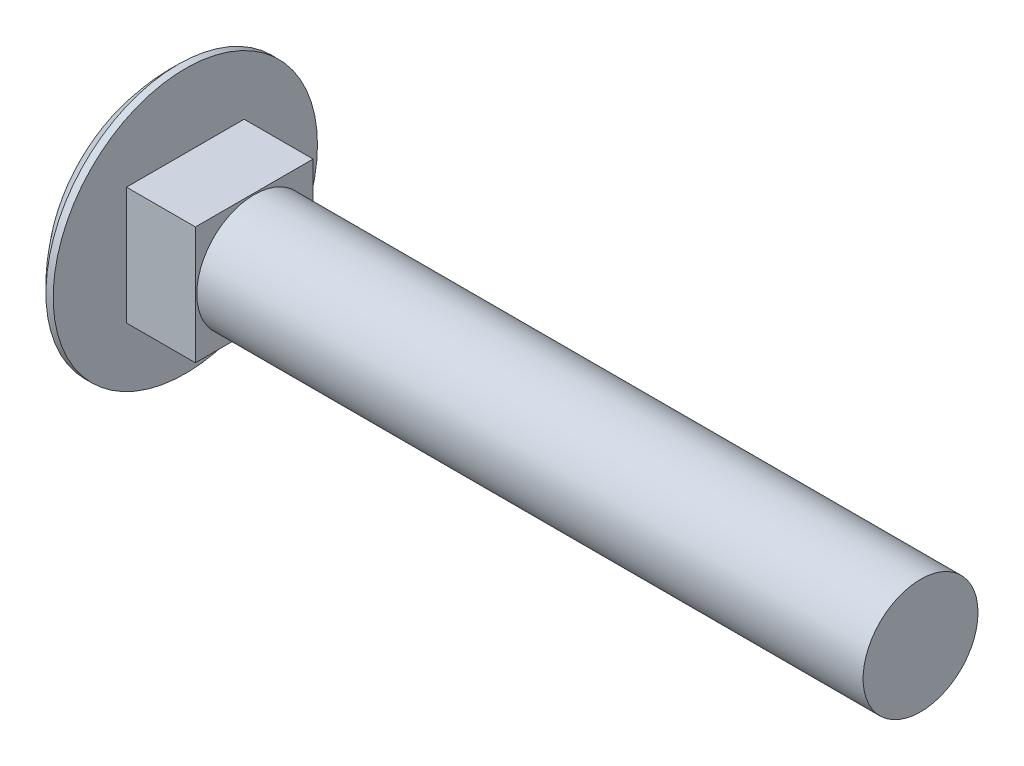
ISO-10303-21;
HEADER;
FILE_DESCRIPTION(('STEP AP214'),'2;1');
FILE_NAME('part.step','',(''),(''),'','','');
FILE_SCHEMA(('AUTOMOTIVE_DESIGN { 1 0 10303 214 1 1 1 1 }'));
ENDSEC;
DATA;
#1=APPLICATION_CONTEXT('core data for automotive mechanical design processes');
#2=APPLICATION_PROTOCOL_DEFINITION('international standard','automotive_design',2000,#1);
#3=PRODUCT_CONTEXT('',#1,'mechanical');
#4=PRODUCT('Part','Part','',(#3));
#5=PRODUCT_RELATED_PRODUCT_CATEGORY('part','',(#4));
#6=PRODUCT_DEFINITION_FORMATION('','',#4);
#7=PRODUCT_DEFINITION_CONTEXT('part definition',#1,'design');
#8=PRODUCT_DEFINITION('design','',#6,#7);
#9=PRODUCT_DEFINITION_SHAPE('','',#8);
#10=(LENGTH_UNIT() NAMED_UNIT(*) SI_UNIT(.MILLI.,.METRE.));
#11=(NAMED_UNIT(*) PLANE_ANGLE_UNIT() SI_UNIT($,.RADIAN.));
#12=(NAMED_UNIT(*) SI_UNIT($,.STERADIAN.) SOLID_ANGLE_UNIT());
#13=UNCERTAINTY_MEASURE_WITH_UNIT(LENGTH_MEASURE(1.E-05),#10,'distance_accuracy_value','');
#14=(GEOMETRIC_REPRESENTATION_CONTEXT(3) GLOBAL_UNCERTAINTY_ASSIGNED_CONTEXT((#13)) GLOBAL_UNIT_ASSIGNED_CONTEXT((#10,
#11,#12)) REPRESENTATION_CONTEXT('',''));
#15=CARTESIAN_POINT('',(0.,0.,0.));
#16=DIRECTION('',(0.,0.,1.));
#17=DIRECTION('',(1.,0.,0.));
#18=AXIS2_PLACEMENT_3D('',#15,#16,#17);
#19=CARTESIAN_POINT('',(4.4704,9.1313,0.));
#20=DIRECTION('',(1.,0.,0.));
#21=DIRECTION('',(0.,0.,-1.));
#22=AXIS2_PLACEMENT_3D('',#19,#20,#21);
#23=PLANE('',#22);
#24=CARTESIAN_POINT('',(4.4704,0.,0.));
#25=DIRECTION('',(1.,0.,0.));
#26=DIRECTION('',(0.,0.,-1.));
#27=AXIS2_PLACEMENT_3D('',#24,#25,#26);
#28=CIRCLE('',#27,9.1313);
#29=CARTESIAN_POINT('',(4.4704,0.,-9.1313));
#30=VERTEX_POINT('',#29);
#31=EDGE_CURVE('E42',#30,#30,#28,.T.);
#32=ORIENTED_EDGE('',*,*,#31,.T.);
#33=EDGE_LOOP('',(#32));
#34=FACE_BOUND('',#33,.T.);
#35=DIRECTION('',(0.,-1.,0.));
#36=VECTOR('',#35,1.);
#37=CARTESIAN_POINT('',(4.4704,-4.064,4.064));
#38=LINE('',#37,#36);
#39=CARTESIAN_POINT('',(4.4704,4.064,4.064));
#40=VERTEX_POINT('',#39);
#41=CARTESIAN_POINT('',(4.4704,-4.064,4.064));
#42=VERTEX_POINT('',#41);
#43=EDGE_CURVE('E88',#40,#42,#38,.T.);
#44=ORIENTED_EDGE('',*,*,#43,.F.);
#45=DIRECTION('',(0.,0.,1.));
#46=VECTOR('',#45,1.);
#47=CARTESIAN_POINT('',(4.4704,4.064,-4.064));
#48=LINE('',#47,#46);
#49=CARTESIAN_POINT('',(4.4704,4.064,-4.064));
#50=VERTEX_POINT('',#49);
#51=EDGE_CURVE('E49',#50,#40,#48,.T.);
#52=ORIENTED_EDGE('',*,*,#51,.F.);
#53=DIRECTION('',(0.,1.,0.));
#54=VECTOR('',#53,1.);
#55=CARTESIAN_POINT('',(4.4704,-4.064,-4.064));
#56=LINE('',#55,#54);
#57=CARTESIAN_POINT('',(4.4704,-4.064,-4.064));
#58=VERTEX_POINT('',#57);
#59=EDGE_CURVE('E94',#58,#50,#56,.T.);
#60=ORIENTED_EDGE('',*,*,#59,.F.);
#61=DIRECTION('',(0.,0.,-1.));
#62=VECTOR('',#61,1.);
#63=CARTESIAN_POINT('',(4.4704,-4.064,-4.064));
#64=LINE('',#63,#62);
#65=EDGE_CURVE('E80',#42,#58,#64,.T.);
#66=ORIENTED_EDGE('',*,*,#65,.F.);
#67=EDGE_LOOP('',(#44,#52,#60,#66));
#68=FACE_BOUND('',#67,.T.);
#69=ADVANCED_FACE('F34',(#34,#68),#23,.T.);
#70=CARTESIAN_POINT('',(12.4854820484082,0.,0.));
#71=DIRECTION('',(1.,0.,0.));
#72=DIRECTION('',(0.,1.,0.));
#73=AXIS2_PLACEMENT_3D('',#70,#71,#72);
#74=SPHERICAL_SURFACE('',#73,12.4854820484082);
#75=CARTESIAN_POINT('',(3.9704,0.,0.));
#76=DIRECTION('',(1.,0.,0.));
#77=DIRECTION('',(0.,0.,-1.));
#78=AXIS2_PLACEMENT_3D('',#75,#76,#77);
#79=CIRCLE('',#78,9.1313);
#80=CARTESIAN_POINT('',(3.9704,0.,-9.1313));
#81=VERTEX_POINT('',#80);
#82=EDGE_CURVE('E11',#81,#81,#79,.T.);
#83=ORIENTED_EDGE('',*,*,#82,.F.);
#84=EDGE_LOOP('',(#83));
#85=FACE_BOUND('',#84,.T.);
#86=ADVANCED_FACE('F36',(#85),#74,.T.);
#87=CARTESIAN_POINT('',(0.,0.,0.));
#88=DIRECTION('',(1.,0.,0.));
#89=DIRECTION('',(0.,0.,-1.));
#90=AXIS2_PLACEMENT_3D('',#87,#88,#89);
#91=CYLINDRICAL_SURFACE('',#90,9.1313);
#92=ORIENTED_EDGE('',*,*,#82,.T.);
#93=EDGE_LOOP('',(#92));
#94=FACE_BOUND('',#93,.T.);
#95=ORIENTED_EDGE('',*,*,#31,.F.);
#96=EDGE_LOOP('',(#95));
#97=FACE_BOUND('',#96,.T.);
#98=ADVANCED_FACE('F117',(#94,#97),#91,.T.);
#99=CARTESIAN_POINT('',(20.7276278349685,4.064,-4.064));
#100=DIRECTION('',(0.,-1.,0.));
#101=DIRECTION('',(0.,0.,-1.));
#102=AXIS2_PLACEMENT_3D('',#99,#100,#101);
#103=PLANE('',#102);
#104=DIRECTION('',(-1.,0.,0.));
#105=VECTOR('',#104,1.);
#106=CARTESIAN_POINT('',(20.7276278349685,4.064,4.064));
#107=LINE('',#106,#105);
#108=CARTESIAN_POINT('',(9.2329,4.064,4.064));
#109=VERTEX_POINT('',#108);
#110=EDGE_CURVE('E90',#109,#40,#107,.T.);
#111=ORIENTED_EDGE('',*,*,#110,.F.);
#112=DIRECTION('',(0.,0.,-1.));
#113=VECTOR('',#112,1.);
#114=CARTESIAN_POINT('',(9.2329,4.064,-4.064));
#115=LINE('',#114,#113);
#116=CARTESIAN_POINT('',(9.2329,4.064,-4.064));
#117=VERTEX_POINT('',#116);
#118=EDGE_CURVE('E84',#109,#117,#115,.T.);
#119=ORIENTED_EDGE('',*,*,#118,.T.);
#120=DIRECTION('',(-1.,0.,0.));
#121=VECTOR('',#120,1.);
#122=CARTESIAN_POINT('',(20.7276278349685,4.064,-4.064));
#123=LINE('',#122,#121);
#124=EDGE_CURVE('E101',#117,#50,#123,.T.);
#125=ORIENTED_EDGE('',*,*,#124,.T.);
#126=ORIENTED_EDGE('',*,*,#51,.T.);
#127=EDGE_LOOP('',(#111,#119,#125,#126));
#128=FACE_BOUND('',#127,.T.);
#129=ADVANCED_FACE('F119',(#128),#103,.F.);
#130=CARTESIAN_POINT('',(20.7276278349685,-4.064,-4.064));
#131=DIRECTION('',(0.,0.,1.));
#132=DIRECTION('',(1.,0.,0.));
#133=AXIS2_PLACEMENT_3D('',#130,#131,#132);
#134=PLANE('',#133);
#135=ORIENTED_EDGE('',*,*,#124,.F.);
#136=DIRECTION('',(0.,-1.,0.));
#137=VECTOR('',#136,1.);
#138=CARTESIAN_POINT('',(9.2329,-4.064,-4.064));
#139=LINE('',#138,#137);
#140=CARTESIAN_POINT('',(9.2329,-4.064,-4.064));
#141=VERTEX_POINT('',#140);
#142=EDGE_CURVE('E106',#117,#141,#139,.T.);
#143=ORIENTED_EDGE('',*,*,#142,.T.);
#144=DIRECTION('',(-1.,0.,0.));
#145=VECTOR('',#144,1.);
#146=CARTESIAN_POINT('',(20.7276278349685,-4.064,-4.064));
#147=LINE('',#146,#145);
#148=EDGE_CURVE('E85',#141,#58,#147,.T.);
#149=ORIENTED_EDGE('',*,*,#148,.T.);
#150=ORIENTED_EDGE('',*,*,#59,.T.);
#151=EDGE_LOOP('',(#135,#143,#149,#150));
#152=FACE_BOUND('',#151,.T.);
#153=ADVANCED_FACE('F125',(#152),#134,.F.);
#154=CARTESIAN_POINT('',(20.7276278349685,-4.064,-4.064));
#155=DIRECTION('',(0.,1.,0.));
#156=DIRECTION('',(0.,0.,1.));
#157=AXIS2_PLACEMENT_3D('',#154,#155,#156);
#158=PLANE('',#157);
#159=ORIENTED_EDGE('',*,*,#148,.F.);
#160=DIRECTION('',(0.,0.,1.));
#161=VECTOR('',#160,1.);
#162=CARTESIAN_POINT('',(9.2329,-4.064,-4.064));
#163=LINE('',#162,#161);
#164=CARTESIAN_POINT('',(9.2329,-4.064,4.064));
#165=VERTEX_POINT('',#164);
#166=EDGE_CURVE('E57',#141,#165,#163,.T.);
#167=ORIENTED_EDGE('',*,*,#166,.T.);
#168=DIRECTION('',(-1.,0.,0.));
#169=VECTOR('',#168,1.);
#170=CARTESIAN_POINT('',(20.7276278349685,-4.064,4.064));
#171=LINE('',#170,#169);
#172=EDGE_CURVE('E76',#165,#42,#171,.T.);
#173=ORIENTED_EDGE('',*,*,#172,.T.);
#174=ORIENTED_EDGE('',*,*,#65,.T.);
#175=EDGE_LOOP('',(#159,#167,#173,#174));
#176=FACE_BOUND('',#175,.T.);
#177=ADVANCED_FACE('F78',(#176),#158,.F.);
#178=CARTESIAN_POINT('',(20.7276278349685,-4.064,4.064));
#179=DIRECTION('',(0.,0.,-1.));
#180=DIRECTION('',(-1.,0.,0.));
#181=AXIS2_PLACEMENT_3D('',#178,#179,#180);
#182=PLANE('',#181);
#183=ORIENTED_EDGE('',*,*,#172,.F.);
#184=DIRECTION('',(0.,1.,0.));
#185=VECTOR('',#184,1.);
#186=CARTESIAN_POINT('',(9.2329,-4.064,4.064));
#187=LINE('',#186,#185);
#188=EDGE_CURVE('E111',#165,#109,#187,.T.);
#189=ORIENTED_EDGE('',*,*,#188,.T.);
#190=ORIENTED_EDGE('',*,*,#110,.T.);
#191=ORIENTED_EDGE('',*,*,#43,.T.);
#192=EDGE_LOOP('',(#183,#189,#190,#191));
#193=FACE_BOUND('',#192,.T.);
#194=ADVANCED_FACE('F89',(#193),#182,.F.);
#195=CARTESIAN_POINT('',(9.2329,3.81,0.));
#196=DIRECTION('',(-1.,0.,0.));
#197=DIRECTION('',(0.,0.,1.));
#198=AXIS2_PLACEMENT_3D('',#195,#196,#197);
#199=PLANE('',#198);
#200=CARTESIAN_POINT('',(9.2329,0.,0.));
#201=DIRECTION('',(-1.,0.,0.));
#202=DIRECTION('',(0.,0.,1.));
#203=AXIS2_PLACEMENT_3D('',#200,#201,#202);
#204=CIRCLE('',#203,3.96875);
#205=CARTESIAN_POINT('',(9.2329,0.,3.96875));
#206=VERTEX_POINT('',#205);
#207=EDGE_CURVE('E107',#206,#206,#204,.F.);
#208=ORIENTED_EDGE('',*,*,#207,.F.);
#209=EDGE_LOOP('',(#208));
#210=FACE_BOUND('',#209,.T.);
#211=ORIENTED_EDGE('',*,*,#166,.F.);
#212=ORIENTED_EDGE('',*,*,#142,.F.);
#213=ORIENTED_EDGE('',*,*,#118,.F.);
#214=ORIENTED_EDGE('',*,*,#188,.F.);
#215=EDGE_LOOP('',(#211,#212,#213,#214));
#216=FACE_BOUND('',#215,.T.);
#217=ADVANCED_FACE('F140',(#210,#216),#199,.F.);
#218=CARTESIAN_POINT('',(55.2704,3.96875,0.));
#219=DIRECTION('',(1.,0.,0.));
#220=DIRECTION('',(0.,0.,-1.));
#221=AXIS2_PLACEMENT_3D('',#218,#219,#220);
#222=PLANE('',#221);
#223=CARTESIAN_POINT('',(55.2704,0.,0.));
#224=DIRECTION('',(1.,0.,0.));
#225=DIRECTION('',(0.,0.,-1.));
#226=AXIS2_PLACEMENT_3D('',#223,#224,#225);
#227=CIRCLE('',#226,3.96875);
#228=CARTESIAN_POINT('',(55.2704,0.,-3.96875));
#229=VERTEX_POINT('',#228);
#230=EDGE_CURVE('E110',#229,#229,#227,.T.);
#231=ORIENTED_EDGE('',*,*,#230,.T.);
#232=EDGE_LOOP('',(#231));
#233=FACE_BOUND('',#232,.T.);
#234=ADVANCED_FACE('F136',(#233),#222,.T.);
#235=CARTESIAN_POINT('',(0.,0.,0.));
#236=DIRECTION('',(1.,0.,0.));
#237=DIRECTION('',(0.,0.,-1.));
#238=AXIS2_PLACEMENT_3D('',#235,#236,#237);
#239=CYLINDRICAL_SURFACE('',#238,3.96875);
#240=ORIENTED_EDGE('',*,*,#207,.T.);
#241=EDGE_LOOP('',(#240));
#242=FACE_BOUND('',#241,.T.);
#243=ORIENTED_EDGE('',*,*,#230,.F.);
#244=EDGE_LOOP('',(#243));
#245=FACE_BOUND('',#244,.T.);
#246=ADVANCED_FACE('F133',(#242,#245),#239,.T.);
#247=CLOSED_SHELL('',(#69,#86,#98,#129,#153,#177,#194,#217,#234,#246));
#248=MANIFOLD_SOLID_BREP('B2',#247);
#249=ADVANCED_BREP_SHAPE_REPRESENTATION('',(#18,#248),#14);
#250=SHAPE_DEFINITION_REPRESENTATION(#9,#249);
ENDSEC;
END-ISO-10303-21;
